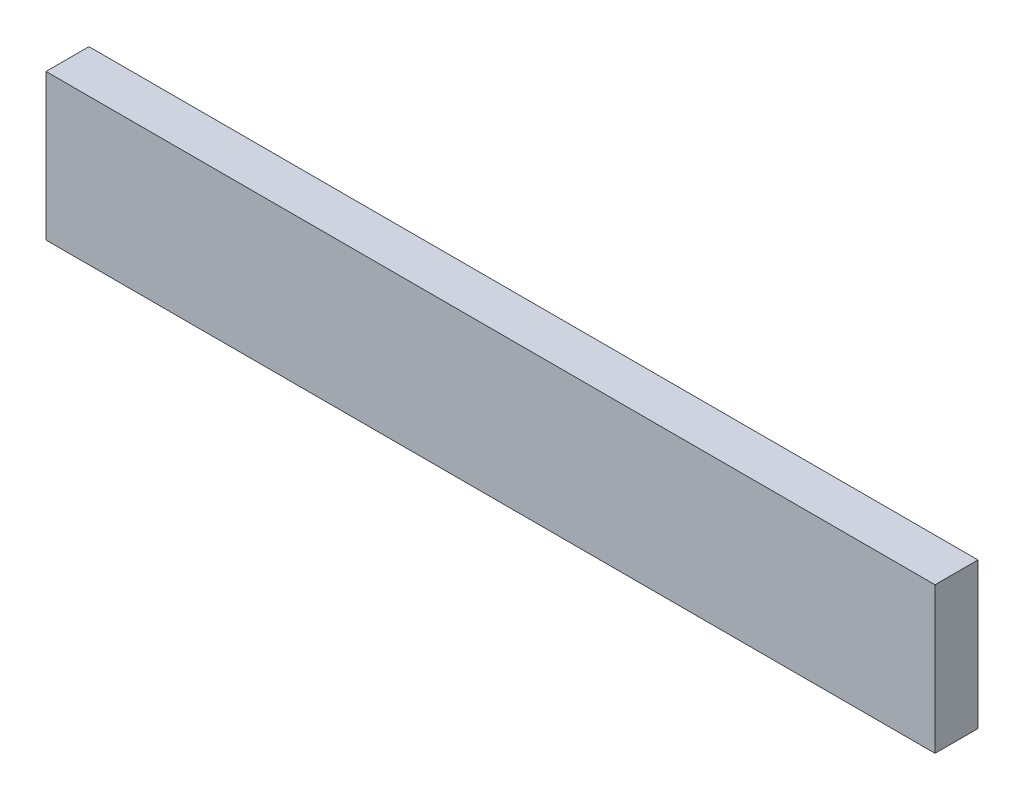
ISO-10303-21;
HEADER;
FILE_DESCRIPTION(('STEP AP214'),'2;1');
FILE_NAME('part.step','',(''),(''),'','','');
FILE_SCHEMA(('AUTOMOTIVE_DESIGN { 1 0 10303 214 1 1 1 1 }'));
ENDSEC;
DATA;
#1=APPLICATION_CONTEXT('core data for automotive mechanical design processes');
#2=APPLICATION_PROTOCOL_DEFINITION('international standard','automotive_design',2000,#1);
#3=PRODUCT_CONTEXT('',#1,'mechanical');
#4=PRODUCT('Part','Part','',(#3));
#5=PRODUCT_RELATED_PRODUCT_CATEGORY('part','',(#4));
#6=PRODUCT_DEFINITION_FORMATION('','',#4);
#7=PRODUCT_DEFINITION_CONTEXT('part definition',#1,'design');
#8=PRODUCT_DEFINITION('design','',#6,#7);
#9=PRODUCT_DEFINITION_SHAPE('','',#8);
#10=(LENGTH_UNIT() NAMED_UNIT(*) SI_UNIT(.MILLI.,.METRE.));
#11=(NAMED_UNIT(*) PLANE_ANGLE_UNIT() SI_UNIT($,.RADIAN.));
#12=(NAMED_UNIT(*) SI_UNIT($,.STERADIAN.) SOLID_ANGLE_UNIT());
#13=UNCERTAINTY_MEASURE_WITH_UNIT(LENGTH_MEASURE(1.E-05),#10,'distance_accuracy_value','');
#14=(GEOMETRIC_REPRESENTATION_CONTEXT(3) GLOBAL_UNCERTAINTY_ASSIGNED_CONTEXT((#13)) GLOBAL_UNIT_ASSIGNED_CONTEXT((#10,
#11,#12)) REPRESENTATION_CONTEXT('',''));
#15=CARTESIAN_POINT('',(0.,0.,0.));
#16=DIRECTION('',(0.,0.,1.));
#17=DIRECTION('',(1.,0.,0.));
#18=AXIS2_PLACEMENT_3D('',#15,#16,#17);
#19=CARTESIAN_POINT('',(103.5,-17.,10.));
#20=DIRECTION('',(-1.,0.,0.));
#21=DIRECTION('',(0.,0.,1.));
#22=AXIS2_PLACEMENT_3D('',#19,#20,#21);
#23=PLANE('',#22);
#24=DIRECTION('',(0.,1.,0.));
#25=VECTOR('',#24,1.);
#26=CARTESIAN_POINT('',(103.5,-17.,0.));
#27=LINE('',#26,#25);
#28=CARTESIAN_POINT('',(103.5,-17.,0.));
#29=VERTEX_POINT('',#28);
#30=CARTESIAN_POINT('',(103.5,17.,0.));
#31=VERTEX_POINT('',#30);
#32=EDGE_CURVE('E98',#29,#31,#27,.T.);
#33=ORIENTED_EDGE('',*,*,#32,.T.);
#34=DIRECTION('',(0.,0.,-1.));
#35=VECTOR('',#34,1.);
#36=CARTESIAN_POINT('',(103.5,17.,10.));
#37=LINE('',#36,#35);
#38=CARTESIAN_POINT('',(103.5,17.,10.));
#39=VERTEX_POINT('',#38);
#40=EDGE_CURVE('E11',#39,#31,#37,.T.);
#41=ORIENTED_EDGE('',*,*,#40,.F.);
#42=DIRECTION('',(0.,1.,0.));
#43=VECTOR('',#42,1.);
#44=CARTESIAN_POINT('',(103.5,-17.,10.));
#45=LINE('',#44,#43);
#46=CARTESIAN_POINT('',(103.5,-17.,10.));
#47=VERTEX_POINT('',#46);
#48=EDGE_CURVE('E86',#47,#39,#45,.T.);
#49=ORIENTED_EDGE('',*,*,#48,.F.);
#50=DIRECTION('',(0.,0.,-1.));
#51=VECTOR('',#50,1.);
#52=CARTESIAN_POINT('',(103.5,-17.,10.));
#53=LINE('',#52,#51);
#54=EDGE_CURVE('E94',#47,#29,#53,.T.);
#55=ORIENTED_EDGE('',*,*,#54,.T.);
#56=EDGE_LOOP('',(#33,#41,#49,#55));
#57=FACE_BOUND('',#56,.T.);
#58=ADVANCED_FACE('F35',(#57),#23,.F.);
#59=CARTESIAN_POINT('',(-103.5,17.,10.));
#60=DIRECTION('',(0.,-1.,0.));
#61=DIRECTION('',(0.,0.,-1.));
#62=AXIS2_PLACEMENT_3D('',#59,#60,#61);
#63=PLANE('',#62);
#64=DIRECTION('',(-1.,0.,0.));
#65=VECTOR('',#64,1.);
#66=CARTESIAN_POINT('',(-103.5,17.,0.));
#67=LINE('',#66,#65);
#68=CARTESIAN_POINT('',(-103.5,17.,0.));
#69=VERTEX_POINT('',#68);
#70=EDGE_CURVE('E90',#31,#69,#67,.T.);
#71=ORIENTED_EDGE('',*,*,#70,.T.);
#72=DIRECTION('',(0.,0.,-1.));
#73=VECTOR('',#72,1.);
#74=CARTESIAN_POINT('',(-103.5,17.,10.));
#75=LINE('',#74,#73);
#76=CARTESIAN_POINT('',(-103.5,17.,10.));
#77=VERTEX_POINT('',#76);
#78=EDGE_CURVE('E43',#77,#69,#75,.T.);
#79=ORIENTED_EDGE('',*,*,#78,.F.);
#80=DIRECTION('',(-1.,0.,0.));
#81=VECTOR('',#80,1.);
#82=CARTESIAN_POINT('',(-103.5,17.,10.));
#83=LINE('',#82,#81);
#84=EDGE_CURVE('E81',#39,#77,#83,.T.);
#85=ORIENTED_EDGE('',*,*,#84,.F.);
#86=ORIENTED_EDGE('',*,*,#40,.T.);
#87=EDGE_LOOP('',(#71,#79,#85,#86));
#88=FACE_BOUND('',#87,.T.);
#89=ADVANCED_FACE('F89',(#88),#63,.F.);
#90=CARTESIAN_POINT('',(-103.5,-17.,10.));
#91=DIRECTION('',(1.,0.,0.));
#92=DIRECTION('',(0.,0.,-1.));
#93=AXIS2_PLACEMENT_3D('',#90,#91,#92);
#94=PLANE('',#93);
#95=DIRECTION('',(0.,-1.,0.));
#96=VECTOR('',#95,1.);
#97=CARTESIAN_POINT('',(-103.5,-17.,0.));
#98=LINE('',#97,#96);
#99=CARTESIAN_POINT('',(-103.5,-17.,0.));
#100=VERTEX_POINT('',#99);
#101=EDGE_CURVE('E68',#69,#100,#98,.T.);
#102=ORIENTED_EDGE('',*,*,#101,.T.);
#103=DIRECTION('',(0.,0.,-1.));
#104=VECTOR('',#103,1.);
#105=CARTESIAN_POINT('',(-103.5,-17.,10.));
#106=LINE('',#105,#104);
#107=CARTESIAN_POINT('',(-103.5,-17.,10.));
#108=VERTEX_POINT('',#107);
#109=EDGE_CURVE('E91',#108,#100,#106,.T.);
#110=ORIENTED_EDGE('',*,*,#109,.F.);
#111=DIRECTION('',(0.,-1.,0.));
#112=VECTOR('',#111,1.);
#113=CARTESIAN_POINT('',(-103.5,-17.,10.));
#114=LINE('',#113,#112);
#115=EDGE_CURVE('E84',#77,#108,#114,.T.);
#116=ORIENTED_EDGE('',*,*,#115,.F.);
#117=ORIENTED_EDGE('',*,*,#78,.T.);
#118=EDGE_LOOP('',(#102,#110,#116,#117));
#119=FACE_BOUND('',#118,.T.);
#120=ADVANCED_FACE('F92',(#119),#94,.F.);
#121=CARTESIAN_POINT('',(-103.5,-17.,10.));
#122=DIRECTION('',(0.,1.,0.));
#123=DIRECTION('',(0.,0.,1.));
#124=AXIS2_PLACEMENT_3D('',#121,#122,#123);
#125=PLANE('',#124);
#126=DIRECTION('',(1.,0.,0.));
#127=VECTOR('',#126,1.);
#128=CARTESIAN_POINT('',(-103.5,-17.,0.));
#129=LINE('',#128,#127);
#130=EDGE_CURVE('E74',#100,#29,#129,.T.);
#131=ORIENTED_EDGE('',*,*,#130,.T.);
#132=ORIENTED_EDGE('',*,*,#54,.F.);
#133=DIRECTION('',(1.,0.,0.));
#134=VECTOR('',#133,1.);
#135=CARTESIAN_POINT('',(-103.5,-17.,10.));
#136=LINE('',#135,#134);
#137=EDGE_CURVE('E51',#108,#47,#136,.T.);
#138=ORIENTED_EDGE('',*,*,#137,.F.);
#139=ORIENTED_EDGE('',*,*,#109,.T.);
#140=EDGE_LOOP('',(#131,#132,#138,#139));
#141=FACE_BOUND('',#140,.T.);
#142=ADVANCED_FACE('F105',(#141),#125,.F.);
#143=CARTESIAN_POINT('',(0.,0.,10.));
#144=DIRECTION('',(0.,0.,-1.));
#145=DIRECTION('',(-1.,0.,0.));
#146=AXIS2_PLACEMENT_3D('',#143,#144,#145);
#147=PLANE('',#146);
#148=ORIENTED_EDGE('',*,*,#48,.T.);
#149=ORIENTED_EDGE('',*,*,#84,.T.);
#150=ORIENTED_EDGE('',*,*,#115,.T.);
#151=ORIENTED_EDGE('',*,*,#137,.T.);
#152=EDGE_LOOP('',(#148,#149,#150,#151));
#153=FACE_BOUND('',#152,.T.);
#154=ADVANCED_FACE('F82',(#153),#147,.F.);
#155=CARTESIAN_POINT('',(0.,0.,0.));
#156=DIRECTION('',(0.,0.,-1.));
#157=DIRECTION('',(-1.,0.,0.));
#158=AXIS2_PLACEMENT_3D('',#155,#156,#157);
#159=PLANE('',#158);
#160=ORIENTED_EDGE('',*,*,#32,.F.);
#161=ORIENTED_EDGE('',*,*,#130,.F.);
#162=ORIENTED_EDGE('',*,*,#101,.F.);
#163=ORIENTED_EDGE('',*,*,#70,.F.);
#164=EDGE_LOOP('',(#160,#161,#162,#163));
#165=FACE_BOUND('',#164,.T.);
#166=ADVANCED_FACE('F108',(#165),#159,.T.);
#167=CLOSED_SHELL('',(#58,#89,#120,#142,#154,#166));
#168=MANIFOLD_SOLID_BREP('B2',#167);
#169=ADVANCED_BREP_SHAPE_REPRESENTATION('',(#18,#168),#14);
#170=SHAPE_DEFINITION_REPRESENTATION(#9,#169);
ENDSEC;
END-ISO-10303-21;
